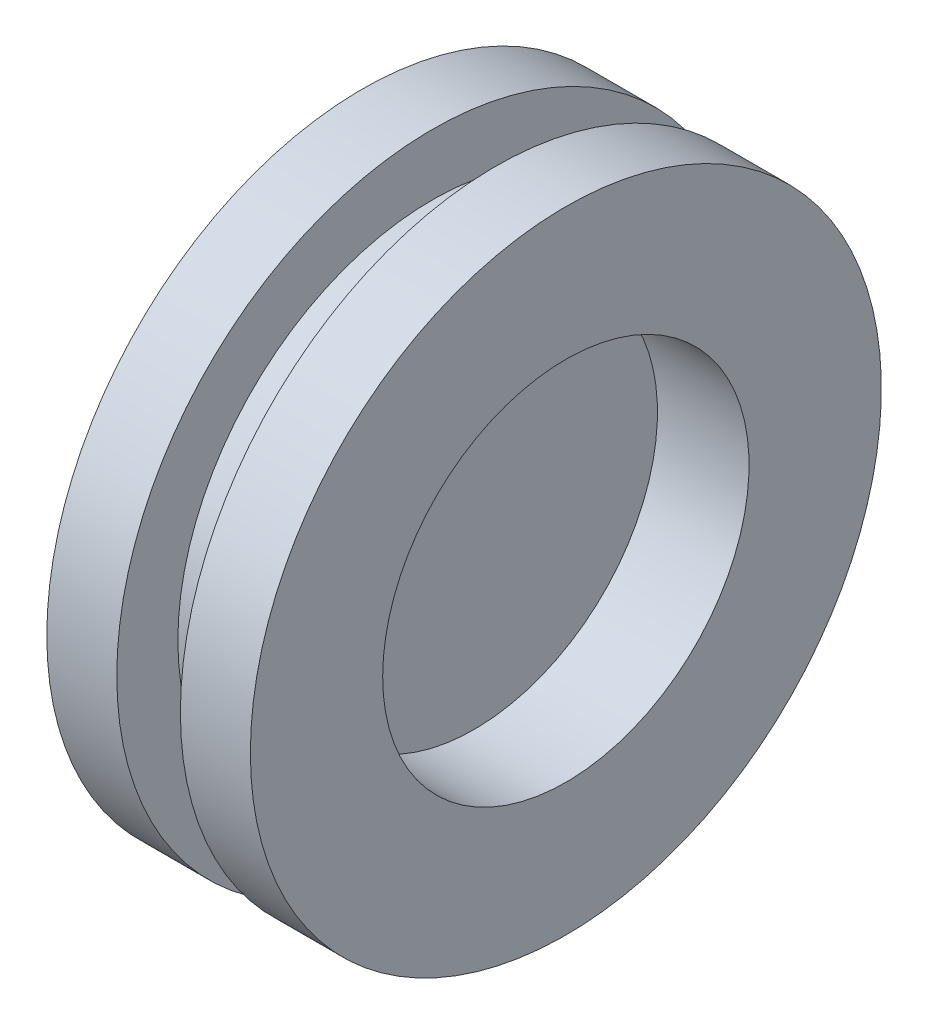
ISO-10303-21;
HEADER;
FILE_DESCRIPTION(('STEP AP214'),'2;1');
FILE_NAME('part.step','',(''),(''),'','','');
FILE_SCHEMA(('AUTOMOTIVE_DESIGN { 1 0 10303 214 1 1 1 1 }'));
ENDSEC;
DATA;
#1=APPLICATION_CONTEXT('core data for automotive mechanical design processes');
#2=APPLICATION_PROTOCOL_DEFINITION('international standard','automotive_design',2000,#1);
#3=PRODUCT_CONTEXT('',#1,'mechanical');
#4=PRODUCT('Part','Part','',(#3));
#5=PRODUCT_RELATED_PRODUCT_CATEGORY('part','',(#4));
#6=PRODUCT_DEFINITION_FORMATION('','',#4);
#7=PRODUCT_DEFINITION_CONTEXT('part definition',#1,'design');
#8=PRODUCT_DEFINITION('design','',#6,#7);
#9=PRODUCT_DEFINITION_SHAPE('','',#8);
#10=(LENGTH_UNIT() NAMED_UNIT(*) SI_UNIT(.MILLI.,.METRE.));
#11=(NAMED_UNIT(*) PLANE_ANGLE_UNIT() SI_UNIT($,.RADIAN.));
#12=(NAMED_UNIT(*) SI_UNIT($,.STERADIAN.) SOLID_ANGLE_UNIT());
#13=UNCERTAINTY_MEASURE_WITH_UNIT(LENGTH_MEASURE(1.E-05),#10,'distance_accuracy_value','');
#14=(GEOMETRIC_REPRESENTATION_CONTEXT(3) GLOBAL_UNCERTAINTY_ASSIGNED_CONTEXT((#13)) GLOBAL_UNIT_ASSIGNED_CONTEXT((#10,
#11,#12)) REPRESENTATION_CONTEXT('',''));
#15=CARTESIAN_POINT('',(0.,0.,0.));
#16=DIRECTION('',(0.,0.,1.));
#17=DIRECTION('',(1.,0.,0.));
#18=AXIS2_PLACEMENT_3D('',#15,#16,#17);
#19=CARTESIAN_POINT('',(-0.254,4.572,0.));
#20=DIRECTION('',(1.,0.,0.));
#21=DIRECTION('',(0.,0.,-1.));
#22=AXIS2_PLACEMENT_3D('',#19,#20,#21);
#23=PLANE('',#22);
#24=CARTESIAN_POINT('',(-0.254,0.,0.));
#25=DIRECTION('',(-1.,0.,0.));
#26=DIRECTION('',(0.,0.,1.));
#27=AXIS2_PLACEMENT_3D('',#24,#25,#26);
#28=CIRCLE('',#27,4.572);
#29=CARTESIAN_POINT('',(-0.254,0.,4.572));
#30=VERTEX_POINT('',#29);
#31=EDGE_CURVE('E66',#30,#30,#28,.T.);
#32=ORIENTED_EDGE('',*,*,#31,.T.);
#33=EDGE_LOOP('',(#32));
#34=FACE_BOUND('',#33,.T.);
#35=ADVANCED_FACE('F32',(#34),#23,.F.);
#36=CARTESIAN_POINT('',(0.254,0.,0.));
#37=DIRECTION('',(-1.,0.,0.));
#38=DIRECTION('',(0.,0.,1.));
#39=AXIS2_PLACEMENT_3D('',#36,#37,#38);
#40=PLANE('',#39);
#41=CARTESIAN_POINT('',(0.254,0.,0.));
#42=DIRECTION('',(-1.,0.,0.));
#43=DIRECTION('',(0.,0.,1.));
#44=AXIS2_PLACEMENT_3D('',#41,#42,#43);
#45=CIRCLE('',#44,4.572);
#46=CARTESIAN_POINT('',(0.254,0.,4.572));
#47=VERTEX_POINT('',#46);
#48=EDGE_CURVE('E10',#47,#47,#45,.T.);
#49=ORIENTED_EDGE('',*,*,#48,.F.);
#50=EDGE_LOOP('',(#49));
#51=FACE_BOUND('',#50,.T.);
#52=ADVANCED_FACE('F120',(#51),#40,.F.);
#53=CARTESIAN_POINT('',(-3.81,0.,0.));
#54=DIRECTION('',(-1.,0.,0.));
#55=DIRECTION('',(0.,0.,1.));
#56=AXIS2_PLACEMENT_3D('',#53,#54,#55);
#57=CYLINDRICAL_SURFACE('',#56,4.572);
#58=CARTESIAN_POINT('',(2.54,0.,0.));
#59=DIRECTION('',(-1.,0.,0.));
#60=DIRECTION('',(0.,0.,1.));
#61=AXIS2_PLACEMENT_3D('',#58,#59,#60);
#62=CIRCLE('',#61,4.572);
#63=CARTESIAN_POINT('',(2.54,0.,4.572));
#64=VERTEX_POINT('',#63);
#65=EDGE_CURVE('E38',#64,#64,#62,.T.);
#66=ORIENTED_EDGE('',*,*,#65,.F.);
#67=EDGE_LOOP('',(#66));
#68=FACE_BOUND('',#67,.T.);
#69=ORIENTED_EDGE('',*,*,#48,.T.);
#70=EDGE_LOOP('',(#69));
#71=FACE_BOUND('',#70,.T.);
#72=ADVANCED_FACE('F115',(#68,#71),#57,.F.);
#73=CARTESIAN_POINT('',(2.54,4.572,0.));
#74=DIRECTION('',(-1.,0.,0.));
#75=DIRECTION('',(0.,0.,1.));
#76=AXIS2_PLACEMENT_3D('',#73,#74,#75);
#77=PLANE('',#76);
#78=CARTESIAN_POINT('',(2.54,0.,0.));
#79=DIRECTION('',(-1.,0.,0.));
#80=DIRECTION('',(0.,0.,1.));
#81=AXIS2_PLACEMENT_3D('',#78,#79,#80);
#82=CIRCLE('',#81,7.874);
#83=CARTESIAN_POINT('',(2.54,0.,7.874));
#84=VERTEX_POINT('',#83);
#85=EDGE_CURVE('E42',#84,#84,#82,.T.);
#86=ORIENTED_EDGE('',*,*,#85,.F.);
#87=EDGE_LOOP('',(#86));
#88=FACE_BOUND('',#87,.T.);
#89=ORIENTED_EDGE('',*,*,#65,.T.);
#90=EDGE_LOOP('',(#89));
#91=FACE_BOUND('',#90,.T.);
#92=ADVANCED_FACE('F110',(#88,#91),#77,.F.);
#93=CARTESIAN_POINT('',(-3.81,0.,0.));
#94=DIRECTION('',(-1.,0.,0.));
#95=DIRECTION('',(0.,0.,1.));
#96=AXIS2_PLACEMENT_3D('',#93,#94,#95);
#97=CYLINDRICAL_SURFACE('',#96,7.874);
#98=CARTESIAN_POINT('',(0.79375,0.,0.));
#99=DIRECTION('',(-1.,0.,0.));
#100=DIRECTION('',(0.,0.,1.));
#101=AXIS2_PLACEMENT_3D('',#98,#99,#100);
#102=CIRCLE('',#101,7.874);
#103=CARTESIAN_POINT('',(0.79375,0.,7.874));
#104=VERTEX_POINT('',#103);
#105=EDGE_CURVE('E46',#104,#104,#102,.T.);
#106=ORIENTED_EDGE('',*,*,#105,.F.);
#107=EDGE_LOOP('',(#106));
#108=FACE_BOUND('',#107,.T.);
#109=ORIENTED_EDGE('',*,*,#85,.T.);
#110=EDGE_LOOP('',(#109));
#111=FACE_BOUND('',#110,.T.);
#112=ADVANCED_FACE('F104',(#108,#111),#97,.T.);
#113=CARTESIAN_POINT('',(0.79375,7.874,0.));
#114=DIRECTION('',(1.,0.,0.));
#115=DIRECTION('',(0.,0.,-1.));
#116=AXIS2_PLACEMENT_3D('',#113,#114,#115);
#117=PLANE('',#116);
#118=CARTESIAN_POINT('',(0.79375,0.,0.));
#119=DIRECTION('',(-1.,0.,0.));
#120=DIRECTION('',(0.,0.,1.));
#121=AXIS2_PLACEMENT_3D('',#118,#119,#120);
#122=CIRCLE('',#121,6.35);
#123=CARTESIAN_POINT('',(0.79375,0.,6.35));
#124=VERTEX_POINT('',#123);
#125=EDGE_CURVE('E51',#124,#124,#122,.T.);
#126=ORIENTED_EDGE('',*,*,#125,.F.);
#127=EDGE_LOOP('',(#126));
#128=FACE_BOUND('',#127,.T.);
#129=ORIENTED_EDGE('',*,*,#105,.T.);
#130=EDGE_LOOP('',(#129));
#131=FACE_BOUND('',#130,.T.);
#132=ADVANCED_FACE('F98',(#128,#131),#117,.F.);
#133=CARTESIAN_POINT('',(-3.81,0.,0.));
#134=DIRECTION('',(-1.,0.,0.));
#135=DIRECTION('',(0.,0.,1.));
#136=AXIS2_PLACEMENT_3D('',#133,#134,#135);
#137=CYLINDRICAL_SURFACE('',#136,6.35);
#138=CARTESIAN_POINT('',(-0.79375,0.,0.));
#139=DIRECTION('',(-1.,0.,0.));
#140=DIRECTION('',(0.,0.,1.));
#141=AXIS2_PLACEMENT_3D('',#138,#139,#140);
#142=CIRCLE('',#141,6.35);
#143=CARTESIAN_POINT('',(-0.79375,0.,6.35));
#144=VERTEX_POINT('',#143);
#145=EDGE_CURVE('E54',#144,#144,#142,.T.);
#146=ORIENTED_EDGE('',*,*,#145,.F.);
#147=EDGE_LOOP('',(#146));
#148=FACE_BOUND('',#147,.T.);
#149=ORIENTED_EDGE('',*,*,#125,.T.);
#150=EDGE_LOOP('',(#149));
#151=FACE_BOUND('',#150,.T.);
#152=ADVANCED_FACE('F92',(#148,#151),#137,.T.);
#153=CARTESIAN_POINT('',(-0.79375,6.35,0.));
#154=DIRECTION('',(-1.,0.,0.));
#155=DIRECTION('',(0.,0.,1.));
#156=AXIS2_PLACEMENT_3D('',#153,#154,#155);
#157=PLANE('',#156);
#158=CARTESIAN_POINT('',(-0.79375,0.,0.));
#159=DIRECTION('',(-1.,0.,0.));
#160=DIRECTION('',(0.,0.,1.));
#161=AXIS2_PLACEMENT_3D('',#158,#159,#160);
#162=CIRCLE('',#161,7.874);
#163=CARTESIAN_POINT('',(-0.79375,0.,7.874));
#164=VERTEX_POINT('',#163);
#165=EDGE_CURVE('E57',#164,#164,#162,.T.);
#166=ORIENTED_EDGE('',*,*,#165,.F.);
#167=EDGE_LOOP('',(#166));
#168=FACE_BOUND('',#167,.T.);
#169=ORIENTED_EDGE('',*,*,#145,.T.);
#170=EDGE_LOOP('',(#169));
#171=FACE_BOUND('',#170,.T.);
#172=ADVANCED_FACE('F86',(#168,#171),#157,.F.);
#173=CARTESIAN_POINT('',(-3.81,0.,0.));
#174=DIRECTION('',(-1.,0.,0.));
#175=DIRECTION('',(0.,0.,1.));
#176=AXIS2_PLACEMENT_3D('',#173,#174,#175);
#177=CYLINDRICAL_SURFACE('',#176,7.874);
#178=CARTESIAN_POINT('',(-2.54,0.,0.));
#179=DIRECTION('',(-1.,0.,0.));
#180=DIRECTION('',(0.,0.,1.));
#181=AXIS2_PLACEMENT_3D('',#178,#179,#180);
#182=CIRCLE('',#181,7.874);
#183=CARTESIAN_POINT('',(-2.54,0.,7.874));
#184=VERTEX_POINT('',#183);
#185=EDGE_CURVE('E60',#184,#184,#182,.T.);
#186=ORIENTED_EDGE('',*,*,#185,.F.);
#187=EDGE_LOOP('',(#186));
#188=FACE_BOUND('',#187,.T.);
#189=ORIENTED_EDGE('',*,*,#165,.T.);
#190=EDGE_LOOP('',(#189));
#191=FACE_BOUND('',#190,.T.);
#192=ADVANCED_FACE('F80',(#188,#191),#177,.T.);
#193=CARTESIAN_POINT('',(-2.54,7.874,0.));
#194=DIRECTION('',(1.,0.,0.));
#195=DIRECTION('',(0.,0.,-1.));
#196=AXIS2_PLACEMENT_3D('',#193,#194,#195);
#197=PLANE('',#196);
#198=CARTESIAN_POINT('',(-2.54,0.,0.));
#199=DIRECTION('',(-1.,0.,0.));
#200=DIRECTION('',(0.,0.,1.));
#201=AXIS2_PLACEMENT_3D('',#198,#199,#200);
#202=CIRCLE('',#201,4.572);
#203=CARTESIAN_POINT('',(-2.54,0.,4.572));
#204=VERTEX_POINT('',#203);
#205=EDGE_CURVE('E63',#204,#204,#202,.T.);
#206=ORIENTED_EDGE('',*,*,#205,.F.);
#207=EDGE_LOOP('',(#206));
#208=FACE_BOUND('',#207,.T.);
#209=ORIENTED_EDGE('',*,*,#185,.T.);
#210=EDGE_LOOP('',(#209));
#211=FACE_BOUND('',#210,.T.);
#212=ADVANCED_FACE('F74',(#208,#211),#197,.F.);
#213=CARTESIAN_POINT('',(-3.81,0.,0.));
#214=DIRECTION('',(-1.,0.,0.));
#215=DIRECTION('',(0.,0.,1.));
#216=AXIS2_PLACEMENT_3D('',#213,#214,#215);
#217=CYLINDRICAL_SURFACE('',#216,4.572);
#218=ORIENTED_EDGE('',*,*,#31,.F.);
#219=EDGE_LOOP('',(#218));
#220=FACE_BOUND('',#219,.T.);
#221=ORIENTED_EDGE('',*,*,#205,.T.);
#222=EDGE_LOOP('',(#221));
#223=FACE_BOUND('',#222,.T.);
#224=ADVANCED_FACE('F71',(#220,#223),#217,.F.);
#225=CLOSED_SHELL('',(#35,#52,#72,#92,#112,#132,#152,#172,#192,#212,#224));
#226=MANIFOLD_SOLID_BREP('B2',#225);
#227=ADVANCED_BREP_SHAPE_REPRESENTATION('',(#18,#226),#14);
#228=SHAPE_DEFINITION_REPRESENTATION(#9,#227);
ENDSEC;
END-ISO-10303-21;
